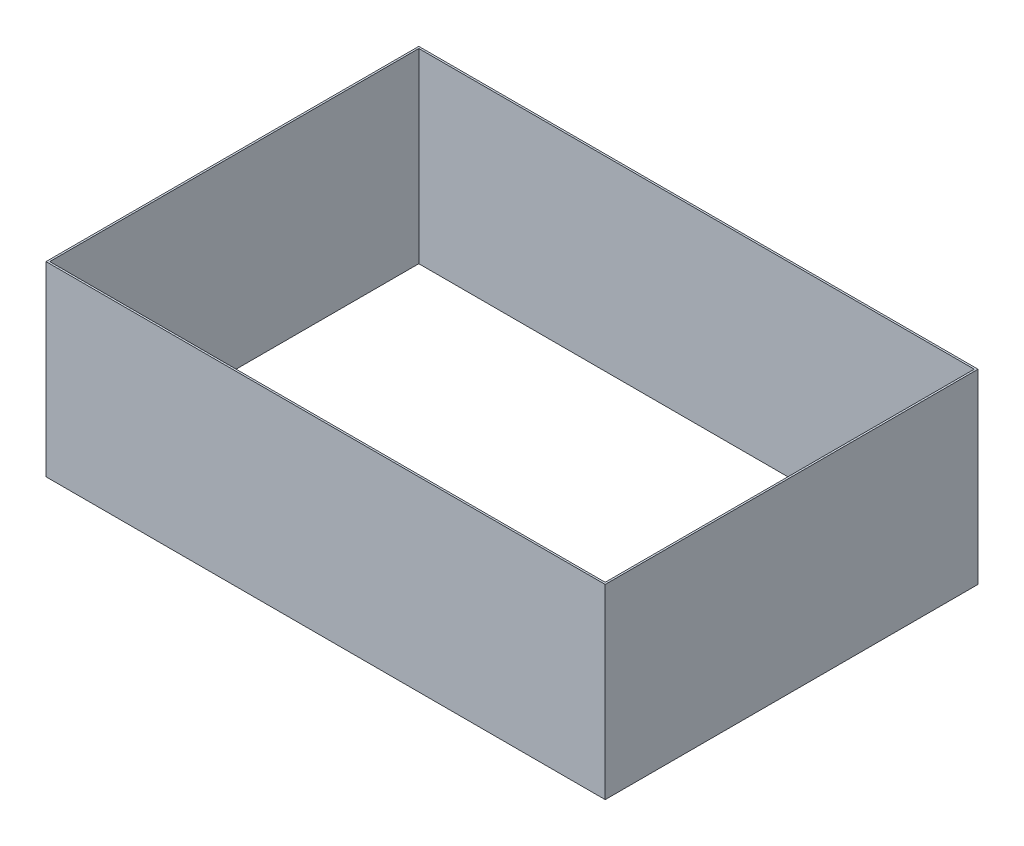
ISO-10303-21;
HEADER;
FILE_DESCRIPTION(('STEP AP214'),'2;1');
FILE_NAME('part.step','',(''),(''),'','','');
FILE_SCHEMA(('AUTOMOTIVE_DESIGN { 1 0 10303 214 1 1 1 1 }'));
ENDSEC;
DATA;
#1=APPLICATION_CONTEXT('core data for automotive mechanical design processes');
#2=APPLICATION_PROTOCOL_DEFINITION('international standard','automotive_design',2000,#1);
#3=PRODUCT_CONTEXT('',#1,'mechanical');
#4=PRODUCT('Part','Part','',(#3));
#5=PRODUCT_RELATED_PRODUCT_CATEGORY('part','',(#4));
#6=PRODUCT_DEFINITION_FORMATION('','',#4);
#7=PRODUCT_DEFINITION_CONTEXT('part definition',#1,'design');
#8=PRODUCT_DEFINITION('design','',#6,#7);
#9=PRODUCT_DEFINITION_SHAPE('','',#8);
#10=(LENGTH_UNIT() NAMED_UNIT(*) SI_UNIT(.MILLI.,.METRE.));
#11=(NAMED_UNIT(*) PLANE_ANGLE_UNIT() SI_UNIT($,.RADIAN.));
#12=(NAMED_UNIT(*) SI_UNIT($,.STERADIAN.) SOLID_ANGLE_UNIT());
#13=UNCERTAINTY_MEASURE_WITH_UNIT(LENGTH_MEASURE(1.E-05),#10,'distance_accuracy_value','');
#14=(GEOMETRIC_REPRESENTATION_CONTEXT(3) GLOBAL_UNCERTAINTY_ASSIGNED_CONTEXT((#13)) GLOBAL_UNIT_ASSIGNED_CONTEXT((#10,
#11,#12)) REPRESENTATION_CONTEXT('',''));
#15=CARTESIAN_POINT('',(0.,0.,0.));
#16=DIRECTION('',(0.,0.,1.));
#17=DIRECTION('',(1.,0.,0.));
#18=AXIS2_PLACEMENT_3D('',#15,#16,#17);
#19=CARTESIAN_POINT('',(0.,100.,0.));
#20=DIRECTION('',(0.,1.,0.));
#21=DIRECTION('',(0.,0.,1.));
#22=AXIS2_PLACEMENT_3D('',#19,#20,#21);
#23=PLANE('',#22);
#24=DIRECTION('',(0.,0.,1.));
#25=VECTOR('',#24,1.);
#26=CARTESIAN_POINT('',(-150.,100.,-100.));
#27=LINE('',#26,#25);
#28=CARTESIAN_POINT('',(-150.,100.,-100.));
#29=VERTEX_POINT('',#28);
#30=CARTESIAN_POINT('',(-150.,100.,100.));
#31=VERTEX_POINT('',#30);
#32=EDGE_CURVE('E160',#29,#31,#27,.T.);
#33=ORIENTED_EDGE('',*,*,#32,.T.);
#34=DIRECTION('',(1.,0.,0.));
#35=VECTOR('',#34,1.);
#36=CARTESIAN_POINT('',(150.,100.,100.));
#37=LINE('',#36,#35);
#38=CARTESIAN_POINT('',(150.,100.,100.));
#39=VERTEX_POINT('',#38);
#40=EDGE_CURVE('E163',#31,#39,#37,.T.);
#41=ORIENTED_EDGE('',*,*,#40,.T.);
#42=DIRECTION('',(0.,0.,-1.));
#43=VECTOR('',#42,1.);
#44=CARTESIAN_POINT('',(150.,100.,-100.));
#45=LINE('',#44,#43);
#46=CARTESIAN_POINT('',(150.,100.,-100.));
#47=VERTEX_POINT('',#46);
#48=EDGE_CURVE('E166',#39,#47,#45,.T.);
#49=ORIENTED_EDGE('',*,*,#48,.T.);
#50=DIRECTION('',(-1.,0.,0.));
#51=VECTOR('',#50,1.);
#52=CARTESIAN_POINT('',(150.,100.,-100.));
#53=LINE('',#52,#51);
#54=EDGE_CURVE('E168',#47,#29,#53,.T.);
#55=ORIENTED_EDGE('',*,*,#54,.T.);
#56=EDGE_LOOP('',(#33,#41,#49,#55));
#57=FACE_BOUND('',#56,.T.);
#58=DIRECTION('',(1.,0.,0.));
#59=VECTOR('',#58,1.);
#60=CARTESIAN_POINT('',(0.,100.,99.));
#61=LINE('',#60,#59);
#62=CARTESIAN_POINT('',(-149.,100.,99.));
#63=VERTEX_POINT('',#62);
#64=CARTESIAN_POINT('',(149.,100.,99.));
#65=VERTEX_POINT('',#64);
#66=EDGE_CURVE('E132',#63,#65,#61,.T.);
#67=ORIENTED_EDGE('',*,*,#66,.F.);
#68=DIRECTION('',(0.,0.,1.));
#69=VECTOR('',#68,1.);
#70=CARTESIAN_POINT('',(-149.,100.,0.));
#71=LINE('',#70,#69);
#72=CARTESIAN_POINT('',(-149.,100.,-99.));
#73=VERTEX_POINT('',#72);
#74=EDGE_CURVE('E124',#73,#63,#71,.T.);
#75=ORIENTED_EDGE('',*,*,#74,.F.);
#76=DIRECTION('',(-1.,0.,0.));
#77=VECTOR('',#76,1.);
#78=CARTESIAN_POINT('',(0.,100.,-99.));
#79=LINE('',#78,#77);
#80=CARTESIAN_POINT('',(149.,100.,-99.));
#81=VERTEX_POINT('',#80);
#82=EDGE_CURVE('E146',#81,#73,#79,.T.);
#83=ORIENTED_EDGE('',*,*,#82,.F.);
#84=DIRECTION('',(0.,0.,-1.));
#85=VECTOR('',#84,1.);
#86=CARTESIAN_POINT('',(149.,100.,0.));
#87=LINE('',#86,#85);
#88=EDGE_CURVE('E144',#65,#81,#87,.T.);
#89=ORIENTED_EDGE('',*,*,#88,.F.);
#90=EDGE_LOOP('',(#67,#75,#83,#89));
#91=FACE_BOUND('',#90,.T.);
#92=ADVANCED_FACE('F59',(#57,#91),#23,.T.);
#93=CARTESIAN_POINT('',(0.,0.,0.));
#94=DIRECTION('',(0.,1.,0.));
#95=DIRECTION('',(0.,0.,1.));
#96=AXIS2_PLACEMENT_3D('',#93,#94,#95);
#97=PLANE('',#96);
#98=DIRECTION('',(0.,0.,1.));
#99=VECTOR('',#98,1.);
#100=CARTESIAN_POINT('',(-150.,0.,-100.));
#101=LINE('',#100,#99);
#102=CARTESIAN_POINT('',(-150.,0.,-100.));
#103=VERTEX_POINT('',#102);
#104=CARTESIAN_POINT('',(-150.,0.,100.));
#105=VERTEX_POINT('',#104);
#106=EDGE_CURVE('E140',#103,#105,#101,.T.);
#107=ORIENTED_EDGE('',*,*,#106,.F.);
#108=DIRECTION('',(-1.,0.,0.));
#109=VECTOR('',#108,1.);
#110=CARTESIAN_POINT('',(150.,0.,-100.));
#111=LINE('',#110,#109);
#112=CARTESIAN_POINT('',(150.,0.,-100.));
#113=VERTEX_POINT('',#112);
#114=EDGE_CURVE('E164',#113,#103,#111,.T.);
#115=ORIENTED_EDGE('',*,*,#114,.F.);
#116=DIRECTION('',(0.,0.,-1.));
#117=VECTOR('',#116,1.);
#118=CARTESIAN_POINT('',(150.,0.,-100.));
#119=LINE('',#118,#117);
#120=CARTESIAN_POINT('',(150.,0.,100.));
#121=VERTEX_POINT('',#120);
#122=EDGE_CURVE('E175',#121,#113,#119,.T.);
#123=ORIENTED_EDGE('',*,*,#122,.F.);
#124=DIRECTION('',(1.,0.,0.));
#125=VECTOR('',#124,1.);
#126=CARTESIAN_POINT('',(150.,0.,100.));
#127=LINE('',#126,#125);
#128=EDGE_CURVE('E173',#105,#121,#127,.T.);
#129=ORIENTED_EDGE('',*,*,#128,.F.);
#130=EDGE_LOOP('',(#107,#115,#123,#129));
#131=FACE_BOUND('',#130,.T.);
#132=DIRECTION('',(0.,0.,1.));
#133=VECTOR('',#132,1.);
#134=CARTESIAN_POINT('',(-149.,0.,0.));
#135=LINE('',#134,#133);
#136=CARTESIAN_POINT('',(-149.,0.,-99.));
#137=VERTEX_POINT('',#136);
#138=CARTESIAN_POINT('',(-149.,0.,99.));
#139=VERTEX_POINT('',#138);
#140=EDGE_CURVE('E82',#137,#139,#135,.T.);
#141=ORIENTED_EDGE('',*,*,#140,.T.);
#142=DIRECTION('',(1.,0.,0.));
#143=VECTOR('',#142,1.);
#144=CARTESIAN_POINT('',(0.,0.,99.));
#145=LINE('',#144,#143);
#146=CARTESIAN_POINT('',(149.,0.,99.));
#147=VERTEX_POINT('',#146);
#148=EDGE_CURVE('E139',#139,#147,#145,.T.);
#149=ORIENTED_EDGE('',*,*,#148,.T.);
#150=DIRECTION('',(0.,0.,-1.));
#151=VECTOR('',#150,1.);
#152=CARTESIAN_POINT('',(149.,0.,0.));
#153=LINE('',#152,#151);
#154=CARTESIAN_POINT('',(149.,0.,-99.));
#155=VERTEX_POINT('',#154);
#156=EDGE_CURVE('E152',#147,#155,#153,.T.);
#157=ORIENTED_EDGE('',*,*,#156,.T.);
#158=DIRECTION('',(-1.,0.,0.));
#159=VECTOR('',#158,1.);
#160=CARTESIAN_POINT('',(0.,0.,-99.));
#161=LINE('',#160,#159);
#162=EDGE_CURVE('E133',#155,#137,#161,.T.);
#163=ORIENTED_EDGE('',*,*,#162,.T.);
#164=EDGE_LOOP('',(#141,#149,#157,#163));
#165=FACE_BOUND('',#164,.T.);
#166=ADVANCED_FACE('F193',(#131,#165),#97,.F.);
#167=CARTESIAN_POINT('',(-150.,100.,-100.));
#168=DIRECTION('',(1.,0.,0.));
#169=DIRECTION('',(0.,0.,-1.));
#170=AXIS2_PLACEMENT_3D('',#167,#168,#169);
#171=PLANE('',#170);
#172=ORIENTED_EDGE('',*,*,#106,.T.);
#173=DIRECTION('',(0.,-1.,0.));
#174=VECTOR('',#173,1.);
#175=CARTESIAN_POINT('',(-150.,100.,100.));
#176=LINE('',#175,#174);
#177=EDGE_CURVE('E12',#31,#105,#176,.T.);
#178=ORIENTED_EDGE('',*,*,#177,.F.);
#179=ORIENTED_EDGE('',*,*,#32,.F.);
#180=DIRECTION('',(0.,-1.,0.));
#181=VECTOR('',#180,1.);
#182=CARTESIAN_POINT('',(-150.,100.,-100.));
#183=LINE('',#182,#181);
#184=EDGE_CURVE('E170',#29,#103,#183,.T.);
#185=ORIENTED_EDGE('',*,*,#184,.T.);
#186=EDGE_LOOP('',(#172,#178,#179,#185));
#187=FACE_BOUND('',#186,.T.);
#188=ADVANCED_FACE('F61',(#187),#171,.F.);
#189=CARTESIAN_POINT('',(150.,100.,100.));
#190=DIRECTION('',(0.,0.,-1.));
#191=DIRECTION('',(-1.,0.,0.));
#192=AXIS2_PLACEMENT_3D('',#189,#190,#191);
#193=PLANE('',#192);
#194=ORIENTED_EDGE('',*,*,#128,.T.);
#195=DIRECTION('',(0.,-1.,0.));
#196=VECTOR('',#195,1.);
#197=CARTESIAN_POINT('',(150.,100.,100.));
#198=LINE('',#197,#196);
#199=EDGE_CURVE('E67',#39,#121,#198,.T.);
#200=ORIENTED_EDGE('',*,*,#199,.F.);
#201=ORIENTED_EDGE('',*,*,#40,.F.);
#202=ORIENTED_EDGE('',*,*,#177,.T.);
#203=EDGE_LOOP('',(#194,#200,#201,#202));
#204=FACE_BOUND('',#203,.T.);
#205=ADVANCED_FACE('F203',(#204),#193,.F.);
#206=CARTESIAN_POINT('',(150.,100.,-100.));
#207=DIRECTION('',(-1.,0.,0.));
#208=DIRECTION('',(0.,0.,1.));
#209=AXIS2_PLACEMENT_3D('',#206,#207,#208);
#210=PLANE('',#209);
#211=ORIENTED_EDGE('',*,*,#122,.T.);
#212=DIRECTION('',(0.,-1.,0.));
#213=VECTOR('',#212,1.);
#214=CARTESIAN_POINT('',(150.,100.,-100.));
#215=LINE('',#214,#213);
#216=EDGE_CURVE('E180',#47,#113,#215,.T.);
#217=ORIENTED_EDGE('',*,*,#216,.F.);
#218=ORIENTED_EDGE('',*,*,#48,.F.);
#219=ORIENTED_EDGE('',*,*,#199,.T.);
#220=EDGE_LOOP('',(#211,#217,#218,#219));
#221=FACE_BOUND('',#220,.T.);
#222=ADVANCED_FACE('F187',(#221),#210,.F.);
#223=CARTESIAN_POINT('',(150.,100.,-100.));
#224=DIRECTION('',(0.,0.,1.));
#225=DIRECTION('',(1.,0.,0.));
#226=AXIS2_PLACEMENT_3D('',#223,#224,#225);
#227=PLANE('',#226);
#228=ORIENTED_EDGE('',*,*,#114,.T.);
#229=ORIENTED_EDGE('',*,*,#184,.F.);
#230=ORIENTED_EDGE('',*,*,#54,.F.);
#231=ORIENTED_EDGE('',*,*,#216,.T.);
#232=EDGE_LOOP('',(#228,#229,#230,#231));
#233=FACE_BOUND('',#232,.T.);
#234=ADVANCED_FACE('F197',(#233),#227,.F.);
#235=CARTESIAN_POINT('',(-149.,100.,0.));
#236=DIRECTION('',(1.,0.,0.));
#237=DIRECTION('',(0.,0.,-1.));
#238=AXIS2_PLACEMENT_3D('',#235,#236,#237);
#239=PLANE('',#238);
#240=ORIENTED_EDGE('',*,*,#140,.F.);
#241=DIRECTION('',(0.,-1.,0.));
#242=VECTOR('',#241,1.);
#243=CARTESIAN_POINT('',(-149.,100.,-99.));
#244=LINE('',#243,#242);
#245=EDGE_CURVE('E128',#73,#137,#244,.T.);
#246=ORIENTED_EDGE('',*,*,#245,.F.);
#247=ORIENTED_EDGE('',*,*,#74,.T.);
#248=DIRECTION('',(0.,-1.,0.));
#249=VECTOR('',#248,1.);
#250=CARTESIAN_POINT('',(-149.,100.,99.));
#251=LINE('',#250,#249);
#252=EDGE_CURVE('E127',#63,#139,#251,.T.);
#253=ORIENTED_EDGE('',*,*,#252,.T.);
#254=EDGE_LOOP('',(#240,#246,#247,#253));
#255=FACE_BOUND('',#254,.T.);
#256=ADVANCED_FACE('F126',(#255),#239,.T.);
#257=CARTESIAN_POINT('',(0.,100.,99.));
#258=DIRECTION('',(0.,0.,-1.));
#259=DIRECTION('',(-1.,0.,0.));
#260=AXIS2_PLACEMENT_3D('',#257,#258,#259);
#261=PLANE('',#260);
#262=ORIENTED_EDGE('',*,*,#148,.F.);
#263=ORIENTED_EDGE('',*,*,#252,.F.);
#264=ORIENTED_EDGE('',*,*,#66,.T.);
#265=DIRECTION('',(0.,-1.,0.));
#266=VECTOR('',#265,1.);
#267=CARTESIAN_POINT('',(149.,100.,99.));
#268=LINE('',#267,#266);
#269=EDGE_CURVE('E141',#65,#147,#268,.T.);
#270=ORIENTED_EDGE('',*,*,#269,.T.);
#271=EDGE_LOOP('',(#262,#263,#264,#270));
#272=FACE_BOUND('',#271,.T.);
#273=ADVANCED_FACE('F136',(#272),#261,.T.);
#274=CARTESIAN_POINT('',(149.,100.,0.));
#275=DIRECTION('',(-1.,0.,0.));
#276=DIRECTION('',(0.,0.,1.));
#277=AXIS2_PLACEMENT_3D('',#274,#275,#276);
#278=PLANE('',#277);
#279=ORIENTED_EDGE('',*,*,#156,.F.);
#280=ORIENTED_EDGE('',*,*,#269,.F.);
#281=ORIENTED_EDGE('',*,*,#88,.T.);
#282=DIRECTION('',(0.,-1.,0.));
#283=VECTOR('',#282,1.);
#284=CARTESIAN_POINT('',(149.,100.,-99.));
#285=LINE('',#284,#283);
#286=EDGE_CURVE('E74',#81,#155,#285,.T.);
#287=ORIENTED_EDGE('',*,*,#286,.T.);
#288=EDGE_LOOP('',(#279,#280,#281,#287));
#289=FACE_BOUND('',#288,.T.);
#290=ADVANCED_FACE('F226',(#289),#278,.T.);
#291=CARTESIAN_POINT('',(0.,100.,-99.));
#292=DIRECTION('',(0.,0.,1.));
#293=DIRECTION('',(1.,0.,0.));
#294=AXIS2_PLACEMENT_3D('',#291,#292,#293);
#295=PLANE('',#294);
#296=ORIENTED_EDGE('',*,*,#162,.F.);
#297=ORIENTED_EDGE('',*,*,#286,.F.);
#298=ORIENTED_EDGE('',*,*,#82,.T.);
#299=ORIENTED_EDGE('',*,*,#245,.T.);
#300=EDGE_LOOP('',(#296,#297,#298,#299));
#301=FACE_BOUND('',#300,.T.);
#302=ADVANCED_FACE('F230',(#301),#295,.T.);
#303=CLOSED_SHELL('',(#92,#166,#188,#205,#222,#234,#256,#273,#290,#302));
#304=MANIFOLD_SOLID_BREP('B2',#303);
#305=ADVANCED_BREP_SHAPE_REPRESENTATION('',(#18,#304),#14);
#306=SHAPE_DEFINITION_REPRESENTATION(#9,#305);
ENDSEC;
END-ISO-10303-21;
